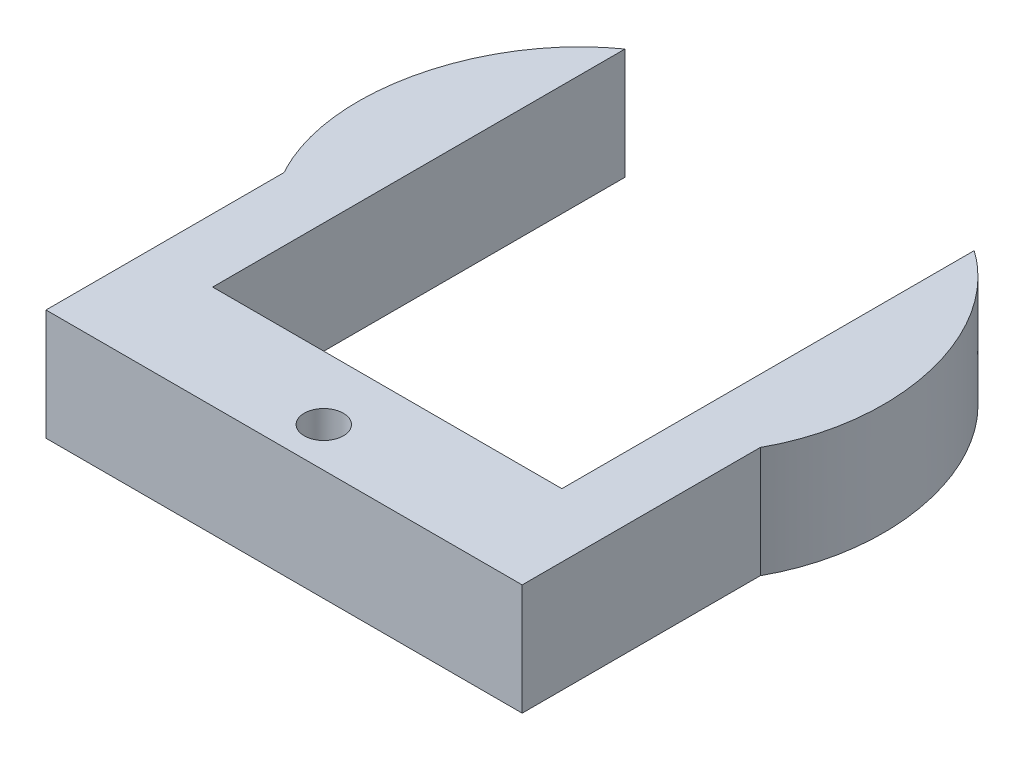
ISO-10303-21;
HEADER;
FILE_DESCRIPTION(('STEP AP214'),'2;1');
FILE_NAME('part.step','',(''),(''),'','','');
FILE_SCHEMA(('AUTOMOTIVE_DESIGN { 1 0 10303 214 1 1 1 1 }'));
ENDSEC;
DATA;
#1=APPLICATION_CONTEXT('core data for automotive mechanical design processes');
#2=APPLICATION_PROTOCOL_DEFINITION('international standard','automotive_design',2000,#1);
#3=PRODUCT_CONTEXT('',#1,'mechanical');
#4=PRODUCT('Part','Part','',(#3));
#5=PRODUCT_RELATED_PRODUCT_CATEGORY('part','',(#4));
#6=PRODUCT_DEFINITION_FORMATION('','',#4);
#7=PRODUCT_DEFINITION_CONTEXT('part definition',#1,'design');
#8=PRODUCT_DEFINITION('design','',#6,#7);
#9=PRODUCT_DEFINITION_SHAPE('','',#8);
#10=(LENGTH_UNIT() NAMED_UNIT(*) SI_UNIT(.MILLI.,.METRE.));
#11=(NAMED_UNIT(*) PLANE_ANGLE_UNIT() SI_UNIT($,.RADIAN.));
#12=(NAMED_UNIT(*) SI_UNIT($,.STERADIAN.) SOLID_ANGLE_UNIT());
#13=UNCERTAINTY_MEASURE_WITH_UNIT(LENGTH_MEASURE(1.E-05),#10,'distance_accuracy_value','');
#14=(GEOMETRIC_REPRESENTATION_CONTEXT(3) GLOBAL_UNCERTAINTY_ASSIGNED_CONTEXT((#13)) GLOBAL_UNIT_ASSIGNED_CONTEXT((#10,
#11,#12)) REPRESENTATION_CONTEXT('',''));
#15=CARTESIAN_POINT('',(0.,0.,0.));
#16=DIRECTION('',(0.,0.,1.));
#17=DIRECTION('',(1.,0.,0.));
#18=AXIS2_PLACEMENT_3D('',#15,#16,#17);
#19=CARTESIAN_POINT('',(0.,14.,-15.));
#20=DIRECTION('',(1.,0.,0.));
#21=DIRECTION('',(0.,0.,-1.));
#22=AXIS2_PLACEMENT_3D('',#19,#20,#21);
#23=PLANE('',#22);
#24=DIRECTION('',(0.,0.,1.));
#25=VECTOR('',#24,1.);
#26=CARTESIAN_POINT('',(0.,0.,-15.));
#27=LINE('',#26,#25);
#28=CARTESIAN_POINT('',(0.,0.,-45.));
#29=VERTEX_POINT('',#28);
#30=CARTESIAN_POINT('',(0.,0.,-15.));
#31=VERTEX_POINT('',#30);
#32=EDGE_CURVE('E132',#29,#31,#27,.T.);
#33=ORIENTED_EDGE('',*,*,#32,.T.);
#34=DIRECTION('',(0.,-1.,0.));
#35=VECTOR('',#34,1.);
#36=CARTESIAN_POINT('',(0.,14.,-15.));
#37=LINE('',#36,#35);
#38=CARTESIAN_POINT('',(0.,14.,-15.));
#39=VERTEX_POINT('',#38);
#40=EDGE_CURVE('E11',#39,#31,#37,.T.);
#41=ORIENTED_EDGE('',*,*,#40,.F.);
#42=DIRECTION('',(0.,0.,1.));
#43=VECTOR('',#42,1.);
#44=CARTESIAN_POINT('',(0.,14.,-15.));
#45=LINE('',#44,#43);
#46=CARTESIAN_POINT('',(0.,14.,-45.));
#47=VERTEX_POINT('',#46);
#48=EDGE_CURVE('E169',#47,#39,#45,.T.);
#49=ORIENTED_EDGE('',*,*,#48,.F.);
#50=DIRECTION('',(0.,-1.,0.));
#51=VECTOR('',#50,1.);
#52=CARTESIAN_POINT('',(0.,14.,-45.));
#53=LINE('',#52,#51);
#54=EDGE_CURVE('E125',#47,#29,#53,.T.);
#55=ORIENTED_EDGE('',*,*,#54,.T.);
#56=EDGE_LOOP('',(#33,#41,#49,#55));
#57=FACE_BOUND('',#56,.T.);
#58=ADVANCED_FACE('F33',(#57),#23,.F.);
#59=CARTESIAN_POINT('',(0.,14.,-15.));
#60=DIRECTION('',(0.,0.,-1.));
#61=DIRECTION('',(-1.,0.,0.));
#62=AXIS2_PLACEMENT_3D('',#59,#60,#61);
#63=PLANE('',#62);
#64=DIRECTION('',(1.,0.,0.));
#65=VECTOR('',#64,1.);
#66=CARTESIAN_POINT('',(0.,0.,-15.));
#67=LINE('',#66,#65);
#68=CARTESIAN_POINT('',(60.,0.,-15.));
#69=VERTEX_POINT('',#68);
#70=EDGE_CURVE('E185',#31,#69,#67,.T.);
#71=ORIENTED_EDGE('',*,*,#70,.T.);
#72=DIRECTION('',(0.,-1.,0.));
#73=VECTOR('',#72,1.);
#74=CARTESIAN_POINT('',(60.,14.,-15.));
#75=LINE('',#74,#73);
#76=CARTESIAN_POINT('',(60.,14.,-15.));
#77=VERTEX_POINT('',#76);
#78=EDGE_CURVE('E41',#77,#69,#75,.T.);
#79=ORIENTED_EDGE('',*,*,#78,.F.);
#80=DIRECTION('',(1.,0.,0.));
#81=VECTOR('',#80,1.);
#82=CARTESIAN_POINT('',(0.,14.,-15.));
#83=LINE('',#82,#81);
#84=EDGE_CURVE('E91',#39,#77,#83,.T.);
#85=ORIENTED_EDGE('',*,*,#84,.F.);
#86=ORIENTED_EDGE('',*,*,#40,.T.);
#87=EDGE_LOOP('',(#71,#79,#85,#86));
#88=FACE_BOUND('',#87,.T.);
#89=ADVANCED_FACE('F221',(#88),#63,.F.);
#90=CARTESIAN_POINT('',(60.,14.,-28.));
#91=DIRECTION('',(-1.,0.,0.));
#92=DIRECTION('',(0.,0.,1.));
#93=AXIS2_PLACEMENT_3D('',#90,#91,#92);
#94=PLANE('',#93);
#95=DIRECTION('',(0.,0.,-1.));
#96=VECTOR('',#95,1.);
#97=CARTESIAN_POINT('',(60.,0.,-28.));
#98=LINE('',#97,#96);
#99=CARTESIAN_POINT('',(60.,0.,-45.));
#100=VERTEX_POINT('',#99);
#101=EDGE_CURVE('E188',#69,#100,#98,.T.);
#102=ORIENTED_EDGE('',*,*,#101,.T.);
#103=DIRECTION('',(0.,-1.,0.));
#104=VECTOR('',#103,1.);
#105=CARTESIAN_POINT('',(60.,14.,-45.));
#106=LINE('',#105,#104);
#107=CARTESIAN_POINT('',(60.,14.,-45.));
#108=VERTEX_POINT('',#107);
#109=EDGE_CURVE('E216',#108,#100,#106,.T.);
#110=ORIENTED_EDGE('',*,*,#109,.F.);
#111=DIRECTION('',(0.,0.,-1.));
#112=VECTOR('',#111,1.);
#113=CARTESIAN_POINT('',(60.,14.,-15.));
#114=LINE('',#113,#112);
#115=EDGE_CURVE('E163',#77,#108,#114,.T.);
#116=ORIENTED_EDGE('',*,*,#115,.F.);
#117=ORIENTED_EDGE('',*,*,#78,.T.);
#118=EDGE_LOOP('',(#102,#110,#116,#117));
#119=FACE_BOUND('',#118,.T.);
#120=ADVANCED_FACE('F156',(#119),#94,.F.);
#121=CARTESIAN_POINT('',(60.,14.,-45.));
#122=CARTESIAN_POINT('',(64.2674134117202,14.,-52.7021578491893));
#123=CARTESIAN_POINT('',(63.8497104287764,14.,-67.2321104164456));
#124=CARTESIAN_POINT('',(55.427779911578,14.,-77.5248648328304));
#125=CARTESIAN_POINT('',(51.9999999999951,14.,-79.9540570080804));
#126=B_SPLINE_CURVE_WITH_KNOTS('',3,(#121,#122,#123,#124,#125),.UNSPECIFIED.,.F.,.F.,(4,1,4),
(0.,0.616858972813257,0.907352470321946),.UNSPECIFIED.);
#127=DIRECTION('',(0.,-1.,0.));
#128=VECTOR('',#127,1.);
#129=SURFACE_OF_LINEAR_EXTRUSION('',#126,#128);
#130=CARTESIAN_POINT('',(60.,0.,-45.));
#131=CARTESIAN_POINT('',(64.2674134117202,0.,-52.7021578491893));
#132=CARTESIAN_POINT('',(63.8497104287764,0.,-67.2321104164456));
#133=CARTESIAN_POINT('',(55.427779911578,0.,-77.5248648328304));
#134=CARTESIAN_POINT('',(51.9999999999951,0.,-79.9540570080804));
#135=B_SPLINE_CURVE_WITH_KNOTS('',3,(#130,#131,#132,#133,#134),.UNSPECIFIED.,.F.,.F.,(4,1,4),
(0.,0.616858972813257,0.907352470321946),.UNSPECIFIED.);
#136=CARTESIAN_POINT('',(51.9999999999951,0.,-79.9540570080804));
#137=VERTEX_POINT('',#136);
#138=EDGE_CURVE('E190',#100,#137,#135,.T.);
#139=ORIENTED_EDGE('',*,*,#138,.T.);
#140=DIRECTION('',(0.,-1.,0.));
#141=VECTOR('',#140,1.);
#142=CARTESIAN_POINT('',(51.9999999999951,14.,-79.9540570080804));
#143=LINE('',#142,#141);
#144=CARTESIAN_POINT('',(51.9999999999951,14.,-79.9540570080804));
#145=VERTEX_POINT('',#144);
#146=EDGE_CURVE('E213',#145,#137,#143,.T.);
#147=ORIENTED_EDGE('',*,*,#146,.F.);
#148=EDGE_CURVE('E158',#108,#145,#126,.T.);
#149=ORIENTED_EDGE('',*,*,#148,.F.);
#150=ORIENTED_EDGE('',*,*,#109,.T.);
#151=EDGE_LOOP('',(#139,#147,#149,#150));
#152=FACE_BOUND('',#151,.T.);
#153=ADVANCED_FACE('F151',(#152),#129,.F.);
#154=CARTESIAN_POINT('',(51.999999999995,14.,-28.));
#155=DIRECTION('',(1.,0.,0.));
#156=DIRECTION('',(0.,0.,-1.));
#157=AXIS2_PLACEMENT_3D('',#154,#155,#156);
#158=PLANE('',#157);
#159=DIRECTION('',(0.,0.,1.));
#160=VECTOR('',#159,1.);
#161=CARTESIAN_POINT('',(51.999999999995,0.,-28.));
#162=LINE('',#161,#160);
#163=CARTESIAN_POINT('',(51.999999999995,0.,-28.));
#164=VERTEX_POINT('',#163);
#165=EDGE_CURVE('E197',#137,#164,#162,.T.);
#166=ORIENTED_EDGE('',*,*,#165,.T.);
#167=DIRECTION('',(0.,-1.,0.));
#168=VECTOR('',#167,1.);
#169=CARTESIAN_POINT('',(51.999999999995,14.,-28.));
#170=LINE('',#169,#168);
#171=CARTESIAN_POINT('',(51.999999999995,14.,-28.));
#172=VERTEX_POINT('',#171);
#173=EDGE_CURVE('E120',#172,#164,#170,.T.);
#174=ORIENTED_EDGE('',*,*,#173,.F.);
#175=DIRECTION('',(0.,0.,1.));
#176=VECTOR('',#175,1.);
#177=CARTESIAN_POINT('',(51.999999999995,14.,-70.29729534041));
#178=LINE('',#177,#176);
#179=EDGE_CURVE('E110',#145,#172,#178,.T.);
#180=ORIENTED_EDGE('',*,*,#179,.F.);
#181=ORIENTED_EDGE('',*,*,#146,.T.);
#182=EDGE_LOOP('',(#166,#174,#180,#181));
#183=FACE_BOUND('',#182,.T.);
#184=ADVANCED_FACE('F148',(#183),#158,.F.);
#185=CARTESIAN_POINT('',(8.00000000000495,14.,-28.));
#186=DIRECTION('',(0.,0.,1.));
#187=DIRECTION('',(1.,0.,0.));
#188=AXIS2_PLACEMENT_3D('',#185,#186,#187);
#189=PLANE('',#188);
#190=DIRECTION('',(-1.,0.,0.));
#191=VECTOR('',#190,1.);
#192=CARTESIAN_POINT('',(8.00000000000495,0.,-28.));
#193=LINE('',#192,#191);
#194=CARTESIAN_POINT('',(8.00000000000495,0.,-28.));
#195=VERTEX_POINT('',#194);
#196=EDGE_CURVE('E119',#164,#195,#193,.T.);
#197=ORIENTED_EDGE('',*,*,#196,.T.);
#198=DIRECTION('',(0.,-1.,0.));
#199=VECTOR('',#198,1.);
#200=CARTESIAN_POINT('',(8.00000000000495,14.,-28.));
#201=LINE('',#200,#199);
#202=CARTESIAN_POINT('',(8.00000000000495,14.,-28.));
#203=VERTEX_POINT('',#202);
#204=EDGE_CURVE('E116',#203,#195,#201,.T.);
#205=ORIENTED_EDGE('',*,*,#204,.F.);
#206=DIRECTION('',(-1.,0.,0.));
#207=VECTOR('',#206,1.);
#208=CARTESIAN_POINT('',(8.00000000000495,14.,-28.));
#209=LINE('',#208,#207);
#210=EDGE_CURVE('E104',#172,#203,#209,.T.);
#211=ORIENTED_EDGE('',*,*,#210,.F.);
#212=ORIENTED_EDGE('',*,*,#173,.T.);
#213=EDGE_LOOP('',(#197,#205,#211,#212));
#214=FACE_BOUND('',#213,.T.);
#215=ADVANCED_FACE('F117',(#214),#189,.F.);
#216=CARTESIAN_POINT('',(8.00000000000495,14.,-67.5014987303513));
#217=DIRECTION('',(-1.,0.,0.));
#218=DIRECTION('',(0.,0.,1.));
#219=AXIS2_PLACEMENT_3D('',#216,#217,#218);
#220=PLANE('',#219);
#221=DIRECTION('',(0.,0.,-1.));
#222=VECTOR('',#221,1.);
#223=CARTESIAN_POINT('',(8.00000000000495,0.,-67.5014987303513));
#224=LINE('',#223,#222);
#225=CARTESIAN_POINT('',(8.00000000000495,0.,-79.9540570080804));
#226=VERTEX_POINT('',#225);
#227=EDGE_CURVE('E77',#195,#226,#224,.T.);
#228=ORIENTED_EDGE('',*,*,#227,.T.);
#229=DIRECTION('',(0.,-1.,0.));
#230=VECTOR('',#229,1.);
#231=CARTESIAN_POINT('',(8.00000000000495,14.,-79.9540570080804));
#232=LINE('',#231,#230);
#233=CARTESIAN_POINT('',(8.00000000000495,14.,-79.9540570080804));
#234=VERTEX_POINT('',#233);
#235=EDGE_CURVE('E121',#234,#226,#232,.T.);
#236=ORIENTED_EDGE('',*,*,#235,.F.);
#237=DIRECTION('',(0.,0.,-1.));
#238=VECTOR('',#237,1.);
#239=CARTESIAN_POINT('',(8.00000000000495,14.,-28.));
#240=LINE('',#239,#238);
#241=EDGE_CURVE('E108',#203,#234,#240,.T.);
#242=ORIENTED_EDGE('',*,*,#241,.F.);
#243=ORIENTED_EDGE('',*,*,#204,.T.);
#244=EDGE_LOOP('',(#228,#236,#242,#243));
#245=FACE_BOUND('',#244,.T.);
#246=ADVANCED_FACE('F123',(#245),#220,.F.);
#247=CARTESIAN_POINT('',(8.00000000000495,14.,-79.9540570080804));
#248=CARTESIAN_POINT('',(4.57222008842203,14.,-77.5248648328304));
#249=CARTESIAN_POINT('',(-3.8497104287764,14.,-67.2321104164456));
#250=CARTESIAN_POINT('',(-4.2674134117202,14.,-52.7021578491893));
#251=CARTESIAN_POINT('',(0.,14.,-45.));
#252=B_SPLINE_CURVE_WITH_KNOTS('',3,(#247,#248,#249,#250,#251),.UNSPECIFIED.,.F.,.F.,(4,1,4),
(0.,0.290493497508689,0.907352470321946),.UNSPECIFIED.);
#253=DIRECTION('',(0.,-1.,0.));
#254=VECTOR('',#253,1.);
#255=SURFACE_OF_LINEAR_EXTRUSION('',#252,#254);
#256=CARTESIAN_POINT('',(8.00000000000495,0.,-79.9540570080804));
#257=CARTESIAN_POINT('',(4.57222008842203,0.,-77.5248648328304));
#258=CARTESIAN_POINT('',(-3.8497104287764,0.,-67.2321104164456));
#259=CARTESIAN_POINT('',(-4.2674134117202,0.,-52.7021578491893));
#260=CARTESIAN_POINT('',(0.,0.,-45.));
#261=B_SPLINE_CURVE_WITH_KNOTS('',3,(#256,#257,#258,#259,#260),.UNSPECIFIED.,.F.,.F.,(4,1,4),
(0.,0.290493497508689,0.907352470321946),.UNSPECIFIED.);
#262=EDGE_CURVE('E83',#226,#29,#261,.T.);
#263=ORIENTED_EDGE('',*,*,#262,.T.);
#264=ORIENTED_EDGE('',*,*,#54,.F.);
#265=EDGE_CURVE('E49',#234,#47,#252,.T.);
#266=ORIENTED_EDGE('',*,*,#265,.F.);
#267=ORIENTED_EDGE('',*,*,#235,.T.);
#268=EDGE_LOOP('',(#263,#264,#266,#267));
#269=FACE_BOUND('',#268,.T.);
#270=ADVANCED_FACE('F138',(#269),#255,.F.);
#271=CARTESIAN_POINT('',(-2.36887368427162,14.,-63.880180178717));
#272=DIRECTION('',(0.,1.,0.));
#273=DIRECTION('',(0.,0.,1.));
#274=AXIS2_PLACEMENT_3D('',#271,#272,#273);
#275=PLANE('',#274);
#276=CARTESIAN_POINT('',(30.,14.,-20.));
#277=DIRECTION('',(0.,1.,0.));
#278=DIRECTION('',(0.,0.,1.));
#279=AXIS2_PLACEMENT_3D('',#276,#277,#278);
#280=CIRCLE('',#279,2.46971811595379);
#281=CARTESIAN_POINT('',(30.,14.,-17.5302818840462));
#282=VERTEX_POINT('',#281);
#283=EDGE_CURVE('E171',#282,#282,#280,.T.);
#284=ORIENTED_EDGE('',*,*,#283,.F.);
#285=EDGE_LOOP('',(#284));
#286=FACE_BOUND('',#285,.T.);
#287=ORIENTED_EDGE('',*,*,#48,.T.);
#288=ORIENTED_EDGE('',*,*,#84,.T.);
#289=ORIENTED_EDGE('',*,*,#115,.T.);
#290=ORIENTED_EDGE('',*,*,#148,.T.);
#291=ORIENTED_EDGE('',*,*,#179,.T.);
#292=ORIENTED_EDGE('',*,*,#210,.T.);
#293=ORIENTED_EDGE('',*,*,#241,.T.);
#294=ORIENTED_EDGE('',*,*,#265,.T.);
#295=EDGE_LOOP('',(#287,#288,#289,#290,#291,#292,#293,#294));
#296=FACE_BOUND('',#295,.T.);
#297=ADVANCED_FACE('F106',(#286,#296),#275,.T.);
#298=CARTESIAN_POINT('',(-2.36887368427162,0.,-63.880180178717));
#299=DIRECTION('',(0.,1.,0.));
#300=DIRECTION('',(0.,0.,1.));
#301=AXIS2_PLACEMENT_3D('',#298,#299,#300);
#302=PLANE('',#301);
#303=CARTESIAN_POINT('',(30.,0.,-20.));
#304=DIRECTION('',(0.,-1.,0.));
#305=DIRECTION('',(0.,0.,-1.));
#306=AXIS2_PLACEMENT_3D('',#303,#304,#305);
#307=CIRCLE('',#306,2.46971811595379);
#308=CARTESIAN_POINT('',(30.,0.,-22.4697181159538));
#309=VERTEX_POINT('',#308);
#310=EDGE_CURVE('E174',#309,#309,#307,.T.);
#311=ORIENTED_EDGE('',*,*,#310,.F.);
#312=EDGE_LOOP('',(#311));
#313=FACE_BOUND('',#312,.T.);
#314=ORIENTED_EDGE('',*,*,#32,.F.);
#315=ORIENTED_EDGE('',*,*,#262,.F.);
#316=ORIENTED_EDGE('',*,*,#227,.F.);
#317=ORIENTED_EDGE('',*,*,#196,.F.);
#318=ORIENTED_EDGE('',*,*,#165,.F.);
#319=ORIENTED_EDGE('',*,*,#138,.F.);
#320=ORIENTED_EDGE('',*,*,#101,.F.);
#321=ORIENTED_EDGE('',*,*,#70,.F.);
#322=EDGE_LOOP('',(#314,#315,#316,#317,#318,#319,#320,#321));
#323=FACE_BOUND('',#322,.T.);
#324=ADVANCED_FACE('F142',(#313,#323),#302,.F.);
#325=CARTESIAN_POINT('',(30.,21.,-20.));
#326=DIRECTION('',(0.,-1.,0.));
#327=DIRECTION('',(0.,0.,-1.));
#328=AXIS2_PLACEMENT_3D('',#325,#326,#327);
#329=CYLINDRICAL_SURFACE('',#328,2.46971811595379);
#330=ORIENTED_EDGE('',*,*,#283,.T.);
#331=EDGE_LOOP('',(#330));
#332=FACE_BOUND('',#331,.T.);
#333=ORIENTED_EDGE('',*,*,#310,.T.);
#334=EDGE_LOOP('',(#333));
#335=FACE_BOUND('',#334,.T.);
#336=ADVANCED_FACE('F178',(#332,#335),#329,.F.);
#337=CLOSED_SHELL('',(#58,#89,#120,#153,#184,#215,#246,#270,#297,#324,#336));
#338=MANIFOLD_SOLID_BREP('B2',#337);
#339=ADVANCED_BREP_SHAPE_REPRESENTATION('',(#18,#338),#14);
#340=SHAPE_DEFINITION_REPRESENTATION(#9,#339);
ENDSEC;
END-ISO-10303-21;
